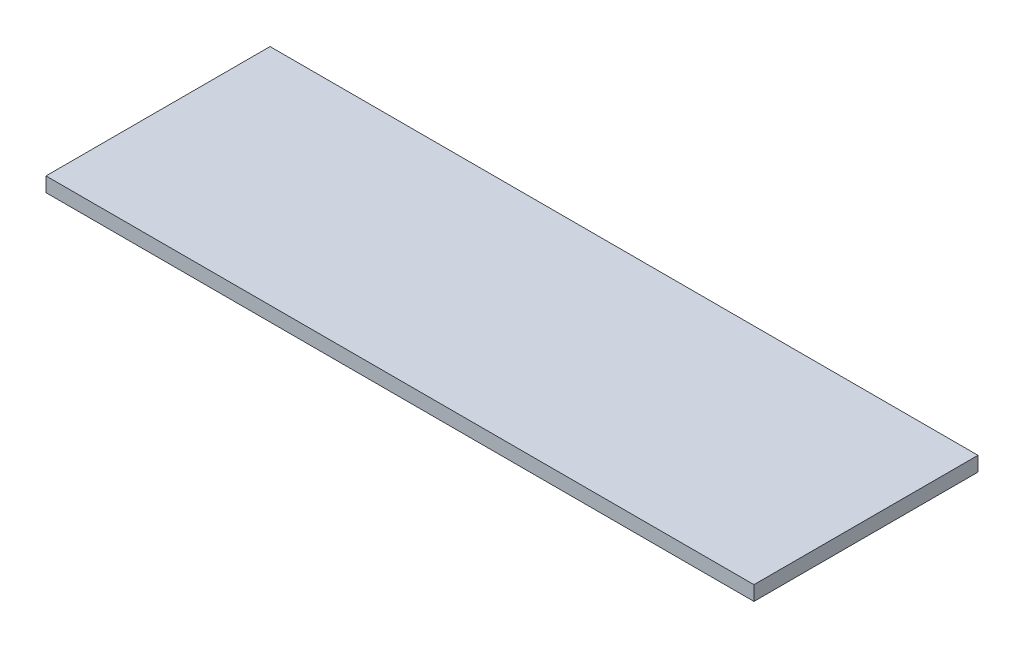
ISO-10303-21;
HEADER;
FILE_DESCRIPTION(('STEP AP214'),'2;1');
FILE_NAME('part.step','',(''),(''),'','','');
FILE_SCHEMA(('AUTOMOTIVE_DESIGN { 1 0 10303 214 1 1 1 1 }'));
ENDSEC;
DATA;
#1=APPLICATION_CONTEXT('core data for automotive mechanical design processes');
#2=APPLICATION_PROTOCOL_DEFINITION('international standard','automotive_design',2000,#1);
#3=PRODUCT_CONTEXT('',#1,'mechanical');
#4=PRODUCT('Part','Part','',(#3));
#5=PRODUCT_RELATED_PRODUCT_CATEGORY('part','',(#4));
#6=PRODUCT_DEFINITION_FORMATION('','',#4);
#7=PRODUCT_DEFINITION_CONTEXT('part definition',#1,'design');
#8=PRODUCT_DEFINITION('design','',#6,#7);
#9=PRODUCT_DEFINITION_SHAPE('','',#8);
#10=(LENGTH_UNIT() NAMED_UNIT(*) SI_UNIT(.MILLI.,.METRE.));
#11=(NAMED_UNIT(*) PLANE_ANGLE_UNIT() SI_UNIT($,.RADIAN.));
#12=(NAMED_UNIT(*) SI_UNIT($,.STERADIAN.) SOLID_ANGLE_UNIT());
#13=UNCERTAINTY_MEASURE_WITH_UNIT(LENGTH_MEASURE(1.E-05),#10,'distance_accuracy_value','');
#14=(GEOMETRIC_REPRESENTATION_CONTEXT(3) GLOBAL_UNCERTAINTY_ASSIGNED_CONTEXT((#13)) GLOBAL_UNIT_ASSIGNED_CONTEXT((#10,
#11,#12)) REPRESENTATION_CONTEXT('',''));
#15=CARTESIAN_POINT('',(0.,0.,0.));
#16=DIRECTION('',(0.,0.,1.));
#17=DIRECTION('',(1.,0.,0.));
#18=AXIS2_PLACEMENT_3D('',#15,#16,#17);
#19=CARTESIAN_POINT('',(0.,6.5,0.));
#20=DIRECTION('',(1.,0.,0.));
#21=DIRECTION('',(0.,0.,-1.));
#22=AXIS2_PLACEMENT_3D('',#19,#20,#21);
#23=PLANE('',#22);
#24=DIRECTION('',(0.,0.,1.));
#25=VECTOR('',#24,1.);
#26=CARTESIAN_POINT('',(0.,0.,0.));
#27=LINE('',#26,#25);
#28=CARTESIAN_POINT('',(0.,0.,-100.));
#29=VERTEX_POINT('',#28);
#30=CARTESIAN_POINT('',(0.,0.,0.));
#31=VERTEX_POINT('',#30);
#32=EDGE_CURVE('E107',#29,#31,#27,.T.);
#33=ORIENTED_EDGE('',*,*,#32,.T.);
#34=DIRECTION('',(0.,-1.,0.));
#35=VECTOR('',#34,1.);
#36=CARTESIAN_POINT('',(0.,6.5,0.));
#37=LINE('',#36,#35);
#38=CARTESIAN_POINT('',(0.,6.5,0.));
#39=VERTEX_POINT('',#38);
#40=EDGE_CURVE('E11',#39,#31,#37,.T.);
#41=ORIENTED_EDGE('',*,*,#40,.F.);
#42=DIRECTION('',(0.,0.,1.));
#43=VECTOR('',#42,1.);
#44=CARTESIAN_POINT('',(0.,6.5,0.));
#45=LINE('',#44,#43);
#46=CARTESIAN_POINT('',(0.,6.5,-100.));
#47=VERTEX_POINT('',#46);
#48=EDGE_CURVE('E91',#47,#39,#45,.T.);
#49=ORIENTED_EDGE('',*,*,#48,.F.);
#50=DIRECTION('',(0.,-1.,0.));
#51=VECTOR('',#50,1.);
#52=CARTESIAN_POINT('',(0.,6.5,-100.));
#53=LINE('',#52,#51);
#54=EDGE_CURVE('E103',#47,#29,#53,.T.);
#55=ORIENTED_EDGE('',*,*,#54,.T.);
#56=EDGE_LOOP('',(#33,#41,#49,#55));
#57=FACE_BOUND('',#56,.T.);
#58=ADVANCED_FACE('F39',(#57),#23,.F.);
#59=CARTESIAN_POINT('',(0.,6.5,0.));
#60=DIRECTION('',(0.,0.,-1.));
#61=DIRECTION('',(-1.,0.,0.));
#62=AXIS2_PLACEMENT_3D('',#59,#60,#61);
#63=PLANE('',#62);
#64=DIRECTION('',(1.,0.,0.));
#65=VECTOR('',#64,1.);
#66=CARTESIAN_POINT('',(0.,0.,0.));
#67=LINE('',#66,#65);
#68=CARTESIAN_POINT('',(316.,0.,0.));
#69=VERTEX_POINT('',#68);
#70=EDGE_CURVE('E96',#31,#69,#67,.T.);
#71=ORIENTED_EDGE('',*,*,#70,.T.);
#72=DIRECTION('',(0.,-1.,0.));
#73=VECTOR('',#72,1.);
#74=CARTESIAN_POINT('',(316.,6.5,0.));
#75=LINE('',#74,#73);
#76=CARTESIAN_POINT('',(316.,6.5,0.));
#77=VERTEX_POINT('',#76);
#78=EDGE_CURVE('E48',#77,#69,#75,.T.);
#79=ORIENTED_EDGE('',*,*,#78,.F.);
#80=DIRECTION('',(1.,0.,0.));
#81=VECTOR('',#80,1.);
#82=CARTESIAN_POINT('',(0.,6.5,0.));
#83=LINE('',#82,#81);
#84=EDGE_CURVE('E86',#39,#77,#83,.T.);
#85=ORIENTED_EDGE('',*,*,#84,.F.);
#86=ORIENTED_EDGE('',*,*,#40,.T.);
#87=EDGE_LOOP('',(#71,#79,#85,#86));
#88=FACE_BOUND('',#87,.T.);
#89=ADVANCED_FACE('F95',(#88),#63,.F.);
#90=CARTESIAN_POINT('',(316.,6.5,0.));
#91=DIRECTION('',(-1.,0.,0.));
#92=DIRECTION('',(0.,0.,1.));
#93=AXIS2_PLACEMENT_3D('',#90,#91,#92);
#94=PLANE('',#93);
#95=DIRECTION('',(0.,0.,-1.));
#96=VECTOR('',#95,1.);
#97=CARTESIAN_POINT('',(316.,0.,0.));
#98=LINE('',#97,#96);
#99=CARTESIAN_POINT('',(316.,0.,-100.));
#100=VERTEX_POINT('',#99);
#101=EDGE_CURVE('E73',#69,#100,#98,.T.);
#102=ORIENTED_EDGE('',*,*,#101,.T.);
#103=DIRECTION('',(0.,-1.,0.));
#104=VECTOR('',#103,1.);
#105=CARTESIAN_POINT('',(316.,6.5,-100.));
#106=LINE('',#105,#104);
#107=CARTESIAN_POINT('',(316.,6.5,-100.));
#108=VERTEX_POINT('',#107);
#109=EDGE_CURVE('E98',#108,#100,#106,.T.);
#110=ORIENTED_EDGE('',*,*,#109,.F.);
#111=DIRECTION('',(0.,0.,-1.));
#112=VECTOR('',#111,1.);
#113=CARTESIAN_POINT('',(316.,6.5,0.));
#114=LINE('',#113,#112);
#115=EDGE_CURVE('E89',#77,#108,#114,.T.);
#116=ORIENTED_EDGE('',*,*,#115,.F.);
#117=ORIENTED_EDGE('',*,*,#78,.T.);
#118=EDGE_LOOP('',(#102,#110,#116,#117));
#119=FACE_BOUND('',#118,.T.);
#120=ADVANCED_FACE('F99',(#119),#94,.F.);
#121=CARTESIAN_POINT('',(0.,6.5,-100.));
#122=DIRECTION('',(0.,0.,1.));
#123=DIRECTION('',(1.,0.,0.));
#124=AXIS2_PLACEMENT_3D('',#121,#122,#123);
#125=PLANE('',#124);
#126=DIRECTION('',(-1.,0.,0.));
#127=VECTOR('',#126,1.);
#128=CARTESIAN_POINT('',(0.,0.,-100.));
#129=LINE('',#128,#127);
#130=EDGE_CURVE('E79',#100,#29,#129,.T.);
#131=ORIENTED_EDGE('',*,*,#130,.T.);
#132=ORIENTED_EDGE('',*,*,#54,.F.);
#133=DIRECTION('',(-1.,0.,0.));
#134=VECTOR('',#133,1.);
#135=CARTESIAN_POINT('',(0.,6.5,-100.));
#136=LINE('',#135,#134);
#137=EDGE_CURVE('E56',#108,#47,#136,.T.);
#138=ORIENTED_EDGE('',*,*,#137,.F.);
#139=ORIENTED_EDGE('',*,*,#109,.T.);
#140=EDGE_LOOP('',(#131,#132,#138,#139));
#141=FACE_BOUND('',#140,.T.);
#142=ADVANCED_FACE('F120',(#141),#125,.F.);
#143=CARTESIAN_POINT('',(0.,6.5,0.));
#144=DIRECTION('',(0.,-1.,0.));
#145=DIRECTION('',(0.,0.,-1.));
#146=AXIS2_PLACEMENT_3D('',#143,#144,#145);
#147=PLANE('',#146);
#148=ORIENTED_EDGE('',*,*,#48,.T.);
#149=ORIENTED_EDGE('',*,*,#84,.T.);
#150=ORIENTED_EDGE('',*,*,#115,.T.);
#151=ORIENTED_EDGE('',*,*,#137,.T.);
#152=EDGE_LOOP('',(#148,#149,#150,#151));
#153=FACE_BOUND('',#152,.T.);
#154=ADVANCED_FACE('F87',(#153),#147,.F.);
#155=CARTESIAN_POINT('',(0.,0.,0.));
#156=DIRECTION('',(0.,-1.,0.));
#157=DIRECTION('',(0.,0.,-1.));
#158=AXIS2_PLACEMENT_3D('',#155,#156,#157);
#159=PLANE('',#158);
#160=ORIENTED_EDGE('',*,*,#32,.F.);
#161=ORIENTED_EDGE('',*,*,#130,.F.);
#162=ORIENTED_EDGE('',*,*,#101,.F.);
#163=ORIENTED_EDGE('',*,*,#70,.F.);
#164=EDGE_LOOP('',(#160,#161,#162,#163));
#165=FACE_BOUND('',#164,.T.);
#166=ADVANCED_FACE('F123',(#165),#159,.T.);
#167=CLOSED_SHELL('',(#58,#89,#120,#142,#154,#166));
#168=MANIFOLD_SOLID_BREP('B2',#167);
#169=ADVANCED_BREP_SHAPE_REPRESENTATION('',(#18,#168),#14);
#170=SHAPE_DEFINITION_REPRESENTATION(#9,#169);
ENDSEC;
END-ISO-10303-21;
